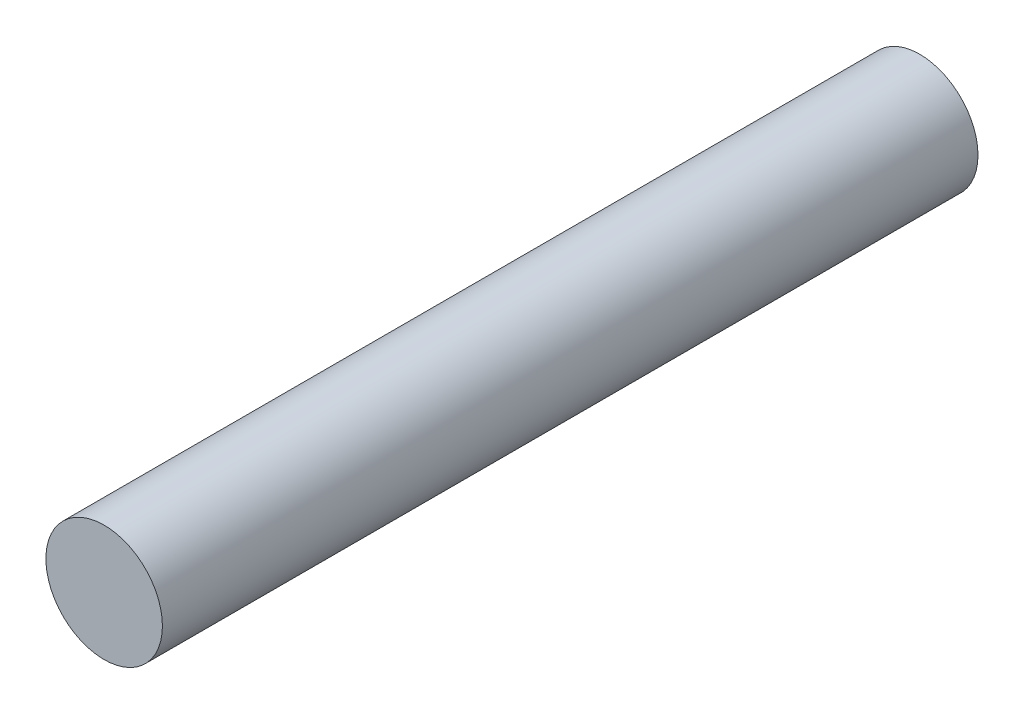
ISO-10303-21;
HEADER;
FILE_DESCRIPTION(('STEP AP214'),'2;1');
FILE_NAME('part.step','',(''),(''),'','','');
FILE_SCHEMA(('AUTOMOTIVE_DESIGN { 1 0 10303 214 1 1 1 1 }'));
ENDSEC;
DATA;
#1=APPLICATION_CONTEXT('core data for automotive mechanical design processes');
#2=APPLICATION_PROTOCOL_DEFINITION('international standard','automotive_design',2000,#1);
#3=PRODUCT_CONTEXT('',#1,'mechanical');
#4=PRODUCT('Part','Part','',(#3));
#5=PRODUCT_RELATED_PRODUCT_CATEGORY('part','',(#4));
#6=PRODUCT_DEFINITION_FORMATION('','',#4);
#7=PRODUCT_DEFINITION_CONTEXT('part definition',#1,'design');
#8=PRODUCT_DEFINITION('design','',#6,#7);
#9=PRODUCT_DEFINITION_SHAPE('','',#8);
#10=(LENGTH_UNIT() NAMED_UNIT(*) SI_UNIT(.MILLI.,.METRE.));
#11=(NAMED_UNIT(*) PLANE_ANGLE_UNIT() SI_UNIT($,.RADIAN.));
#12=(NAMED_UNIT(*) SI_UNIT($,.STERADIAN.) SOLID_ANGLE_UNIT());
#13=UNCERTAINTY_MEASURE_WITH_UNIT(LENGTH_MEASURE(1.E-05),#10,'distance_accuracy_value','');
#14=(GEOMETRIC_REPRESENTATION_CONTEXT(3) GLOBAL_UNCERTAINTY_ASSIGNED_CONTEXT((#13)) GLOBAL_UNIT_ASSIGNED_CONTEXT((#10,
#11,#12)) REPRESENTATION_CONTEXT('',''));
#15=CARTESIAN_POINT('',(0.,0.,0.));
#16=DIRECTION('',(0.,0.,1.));
#17=DIRECTION('',(1.,0.,0.));
#18=AXIS2_PLACEMENT_3D('',#15,#16,#17);
#19=CARTESIAN_POINT('',(0.,0.,14.));
#20=DIRECTION('',(0.,0.,-1.));
#21=DIRECTION('',(-1.,0.,0.));
#22=AXIS2_PLACEMENT_3D('',#19,#20,#21);
#23=CYLINDRICAL_SURFACE('',#22,1.);
#24=CARTESIAN_POINT('',(0.,0.,14.));
#25=DIRECTION('',(0.,0.,1.));
#26=DIRECTION('',(1.,0.,0.));
#27=AXIS2_PLACEMENT_3D('',#24,#25,#26);
#28=CIRCLE('',#27,1.);
#29=CARTESIAN_POINT('',(1.,0.,14.));
#30=VERTEX_POINT('',#29);
#31=EDGE_CURVE('E10',#30,#30,#28,.T.);
#32=ORIENTED_EDGE('',*,*,#31,.F.);
#33=EDGE_LOOP('',(#32));
#34=FACE_BOUND('',#33,.T.);
#35=CARTESIAN_POINT('',(0.,0.,0.));
#36=DIRECTION('',(0.,0.,1.));
#37=DIRECTION('',(1.,0.,0.));
#38=AXIS2_PLACEMENT_3D('',#35,#36,#37);
#39=CIRCLE('',#38,1.);
#40=CARTESIAN_POINT('',(1.,0.,0.));
#41=VERTEX_POINT('',#40);
#42=EDGE_CURVE('E44',#41,#41,#39,.T.);
#43=ORIENTED_EDGE('',*,*,#42,.T.);
#44=EDGE_LOOP('',(#43));
#45=FACE_BOUND('',#44,.T.);
#46=ADVANCED_FACE('F41',(#34,#45),#23,.T.);
#47=CARTESIAN_POINT('',(0.,0.,14.));
#48=DIRECTION('',(0.,0.,1.));
#49=DIRECTION('',(1.,0.,0.));
#50=AXIS2_PLACEMENT_3D('',#47,#48,#49);
#51=PLANE('',#50);
#52=ORIENTED_EDGE('',*,*,#31,.T.);
#53=EDGE_LOOP('',(#52));
#54=FACE_BOUND('',#53,.T.);
#55=ADVANCED_FACE('F58',(#54),#51,.T.);
#56=CARTESIAN_POINT('',(0.,0.,0.));
#57=DIRECTION('',(0.,0.,1.));
#58=DIRECTION('',(1.,0.,0.));
#59=AXIS2_PLACEMENT_3D('',#56,#57,#58);
#60=PLANE('',#59);
#61=ORIENTED_EDGE('',*,*,#42,.F.);
#62=EDGE_LOOP('',(#61));
#63=FACE_BOUND('',#62,.T.);
#64=ADVANCED_FACE('F56',(#63),#60,.F.);
#65=CLOSED_SHELL('',(#46,#55,#64));
#66=MANIFOLD_SOLID_BREP('B2',#65);
#67=ADVANCED_BREP_SHAPE_REPRESENTATION('',(#18,#66),#14);
#68=SHAPE_DEFINITION_REPRESENTATION(#9,#67);
ENDSEC;
END-ISO-10303-21;
